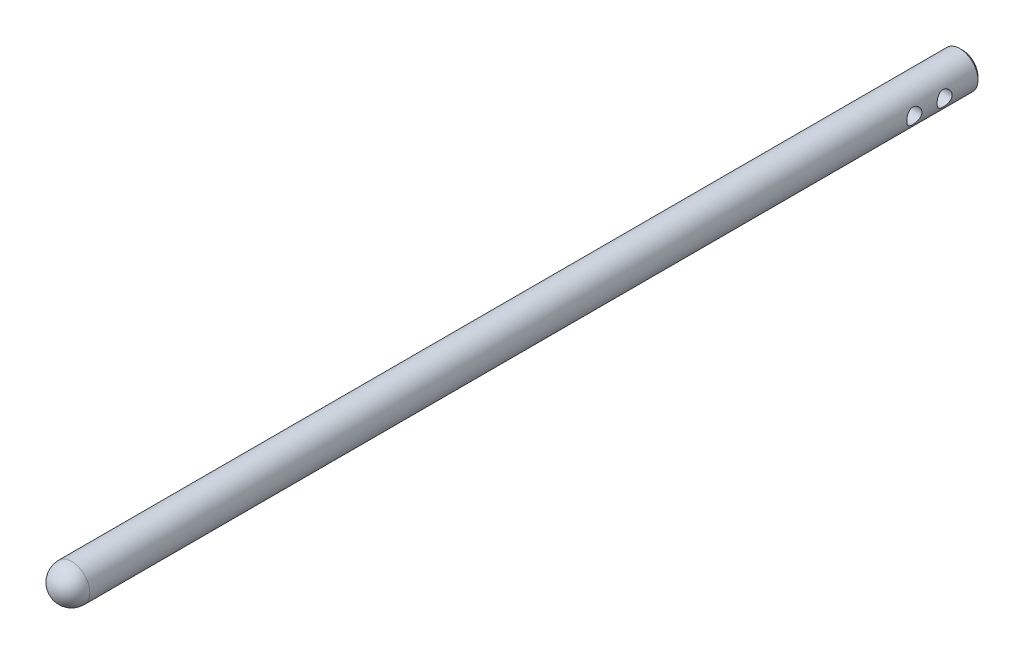
ISO-10303-21;
HEADER;
FILE_DESCRIPTION(('STEP AP214'),'2;1');
FILE_NAME('part.step','',(''),(''),'','','');
FILE_SCHEMA(('AUTOMOTIVE_DESIGN { 1 0 10303 214 1 1 1 1 }'));
ENDSEC;
DATA;
#1=APPLICATION_CONTEXT('core data for automotive mechanical design processes');
#2=APPLICATION_PROTOCOL_DEFINITION('international standard','automotive_design',2000,#1);
#3=PRODUCT_CONTEXT('',#1,'mechanical');
#4=PRODUCT('Part','Part','',(#3));
#5=PRODUCT_RELATED_PRODUCT_CATEGORY('part','',(#4));
#6=PRODUCT_DEFINITION_FORMATION('','',#4);
#7=PRODUCT_DEFINITION_CONTEXT('part definition',#1,'design');
#8=PRODUCT_DEFINITION('design','',#6,#7);
#9=PRODUCT_DEFINITION_SHAPE('','',#8);
#10=(LENGTH_UNIT() NAMED_UNIT(*) SI_UNIT(.MILLI.,.METRE.));
#11=(NAMED_UNIT(*) PLANE_ANGLE_UNIT() SI_UNIT($,.RADIAN.));
#12=(NAMED_UNIT(*) SI_UNIT($,.STERADIAN.) SOLID_ANGLE_UNIT());
#13=UNCERTAINTY_MEASURE_WITH_UNIT(LENGTH_MEASURE(1.E-05),#10,'distance_accuracy_value','');
#14=(GEOMETRIC_REPRESENTATION_CONTEXT(3) GLOBAL_UNCERTAINTY_ASSIGNED_CONTEXT((#13)) GLOBAL_UNIT_ASSIGNED_CONTEXT((#10,
#11,#12)) REPRESENTATION_CONTEXT('',''));
#15=CARTESIAN_POINT('',(0.,0.,0.));
#16=DIRECTION('',(0.,0.,1.));
#17=DIRECTION('',(1.,0.,0.));
#18=AXIS2_PLACEMENT_3D('',#15,#16,#17);
#19=CARTESIAN_POINT('',(0.,0.,300.));
#20=DIRECTION('',(0.,0.,-1.));
#21=DIRECTION('',(-1.,0.,0.));
#22=AXIS2_PLACEMENT_3D('',#19,#20,#21);
#23=CYLINDRICAL_SURFACE('',#22,6.);
#24=CARTESIAN_POINT('',(0.,0.,1.));
#25=DIRECTION('',(0.,0.,1.));
#26=DIRECTION('',(1.,0.,0.));
#27=AXIS2_PLACEMENT_3D('',#24,#25,#26);
#28=CIRCLE('',#27,6.);
#29=CARTESIAN_POINT('',(6.,0.,1.));
#30=VERTEX_POINT('',#29);
#31=EDGE_CURVE('E48',#30,#30,#28,.T.);
#32=ORIENTED_EDGE('',*,*,#31,.T.);
#33=EDGE_LOOP('',(#32));
#34=FACE_BOUND('',#33,.T.);
#35=CARTESIAN_POINT('',(-6.,0.,14.5));
#36=CARTESIAN_POINT('',(-5.99999628290907,-0.133903918163794,14.4999952878603));
#37=CARTESIAN_POINT('',(-5.99546656821164,-0.268039524991432,14.4891786843994));
#38=CARTESIAN_POINT('',(-5.97780115788617,-0.53249801999112,14.4463192619064));
#39=CARTESIAN_POINT('',(-5.96464300599791,-0.662810029808672,14.4142210532185));
#40=CARTESIAN_POINT('',(-5.93112629106012,-0.915376593299222,14.3301785119407));
#41=CARTESIAN_POINT('',(-5.91079213642029,-1.03765681434383,14.2783014076769));
#42=CARTESIAN_POINT('',(-5.8649055925345,-1.27165974779733,14.1564541669781));
#43=CARTESIAN_POINT('',(-5.83935478441347,-1.38338564416287,14.0864895110252));
#44=CARTESIAN_POINT('',(-5.78415660619864,-1.59889674004597,13.9267420881925));
#45=CARTESIAN_POINT('',(-5.75437507703432,-1.70208251703042,13.8361973967483));
#46=CARTESIAN_POINT('',(-5.69465427085228,-1.8923196601971,13.6394713160995));
#47=CARTESIAN_POINT('',(-5.66471491925558,-1.9793625312399,13.5332817462849));
#48=CARTESIAN_POINT('',(-5.60642043928224,-2.13907474876483,13.3019464489895));
#49=CARTESIAN_POINT('',(-5.57821573827599,-2.2108261616941,13.1761251042486));
#50=CARTESIAN_POINT('',(-5.52871144633222,-2.331878813161,12.9128534830571));
#51=CARTESIAN_POINT('',(-5.50740829980501,-2.38119161708799,12.7754092407429));
#52=CARTESIAN_POINT('',(-5.47557110795537,-2.45349196589845,12.4996926167385));
#53=CARTESIAN_POINT('',(-5.46456775308951,-2.47763315746001,12.361779033289));
#54=CARTESIAN_POINT('',(-5.45322652433633,-2.50250419944798,12.0834534145536));
#55=CARTESIAN_POINT('',(-5.45288276849132,-2.5032469611117,11.9430427999296));
#56=CARTESIAN_POINT('',(-5.46250239122985,-2.48216900725155,11.6751998791476));
#57=CARTESIAN_POINT('',(-5.47167765447589,-2.46207362224014,11.5475978068758));
#58=CARTESIAN_POINT('',(-5.49796965547249,-2.40278382032142,11.2977758179945));
#59=CARTESIAN_POINT('',(-5.51508791407034,-2.36358574574513,11.1755569370152));
#60=CARTESIAN_POINT('',(-5.55572369545608,-2.2664391745498,10.9368845940184));
#61=CARTESIAN_POINT('',(-5.57936963898298,-2.20810943078429,10.8206091581736));
#62=CARTESIAN_POINT('',(-5.63036662282146,-2.07462485161169,10.5990445322394));
#63=CARTESIAN_POINT('',(-5.65771912259552,-1.99946338103922,10.4937596987729));
#64=CARTESIAN_POINT('',(-5.71585953755966,-1.82699193108754,10.2878000825344));
#65=CARTESIAN_POINT('',(-5.74674242808947,-1.72834696641502,10.1882668652292));
#66=CARTESIAN_POINT('',(-5.80651346225056,-1.51545918210307,10.0067729940816));
#67=CARTESIAN_POINT('',(-5.83540113754019,-1.40121271889693,9.92481645661564));
#68=CARTESIAN_POINT('',(-5.88876567112946,-1.15689589738675,9.77912835276748));
#69=CARTESIAN_POINT('',(-5.91312533086667,-1.02652116489536,9.71586110969864));
#70=CARTESIAN_POINT('',(-5.95378962829606,-0.755704805053674,9.61255772079348));
#71=CARTESIAN_POINT('',(-5.970098716916,-0.615268789590078,9.57250873611237));
#72=CARTESIAN_POINT('',(-5.9919928237277,-0.337856226692463,9.51916801574673));
#73=CARTESIAN_POINT('',(-5.9981908209425,-0.201222570557285,9.5043442851125));
#74=CARTESIAN_POINT('',(-6.00112100737489,0.0727093109921711,9.49730755277181));
#75=CARTESIAN_POINT('',(-5.99785591423878,0.210007334305264,9.505088059496));
#76=CARTESIAN_POINT('',(-5.9826243531388,0.474196484682864,9.54194216961213));
#77=CARTESIAN_POINT('',(-5.97109774567979,0.60126593327877,9.56993990819439));
#78=CARTESIAN_POINT('',(-5.94097213544829,0.848765497942173,9.64493638908157));
#79=CARTESIAN_POINT('',(-5.92237223919408,0.969194773036707,9.69193753190061));
#80=CARTESIAN_POINT('',(-5.87916541290331,1.20421799973828,9.80514195142422));
#81=CARTESIAN_POINT('',(-5.85438982938561,1.31851447371068,9.87189636629204));
#82=CARTESIAN_POINT('',(-5.80147609158183,1.53469243246282,10.0221067555834));
#83=CARTESIAN_POINT('',(-5.77333653537473,1.63656870520374,10.1055697030586));
#84=CARTESIAN_POINT('',(-5.71424175790868,1.83266686054867,10.2938064665447));
#85=CARTESIAN_POINT('',(-5.68322903182028,1.92582139596022,10.3996770059721));
#86=CARTESIAN_POINT('',(-5.6236867353604,2.09333969221046,10.6260425518712));
#87=CARTESIAN_POINT('',(-5.59515772986988,2.16769918571026,10.746540870345));
#88=CARTESIAN_POINT('',(-5.54362772487864,2.29631920417609,11.0012283506036));
#89=CARTESIAN_POINT('',(-5.52071125109802,2.35027836475451,11.1355880710237));
#90=CARTESIAN_POINT('',(-5.48416711318335,2.43434827902353,11.4127411876261));
#91=CARTESIAN_POINT('',(-5.47053179113073,2.46447869724417,11.5555275249888));
#92=CARTESIAN_POINT('',(-5.4552632907308,2.49808160700531,11.8336373983781));
#93=CARTESIAN_POINT('',(-5.45278701929114,2.50342760836084,11.9686893245119));
#94=CARTESIAN_POINT('',(-5.45787706027259,2.49231151038001,12.2376857223555));
#95=CARTESIAN_POINT('',(-5.46544183100007,2.47585275892879,12.3716303609001));
#96=CARTESIAN_POINT('',(-5.48899102586044,2.42316809595844,12.6281854946778));
#97=CARTESIAN_POINT('',(-5.50456709625453,2.38789807270203,12.7510333459775));
#98=CARTESIAN_POINT('',(-5.54206362465904,2.29952656276963,12.989096043664));
#99=CARTESIAN_POINT('',(-5.56398586515029,2.24642006560089,13.104308734336));
#100=CARTESIAN_POINT('',(-5.61333908853254,2.1202057237392,13.331391788147));
#101=CARTESIAN_POINT('',(-5.64102204404079,2.04608723750136,13.4426446459478));
#102=CARTESIAN_POINT('',(-5.69807379131314,1.88136812596239,13.6517202931151));
#103=CARTESIAN_POINT('',(-5.72744316520044,1.79076178563716,13.7495384050324));
#104=CARTESIAN_POINT('',(-5.78712781593092,1.58780416898838,13.9362973056175));
#105=CARTESIAN_POINT('',(-5.81735619175009,1.47434977868814,14.0240726428278));
#106=CARTESIAN_POINT('',(-5.87320303099821,1.23319985958044,14.1793991300421));
#107=CARTESIAN_POINT('',(-5.89881939160172,1.1054978774169,14.2469410639968));
#108=CARTESIAN_POINT('',(-5.94218308378896,0.841465213422196,14.3584188704516));
#109=CARTESIAN_POINT('',(-5.96005349044659,0.705312056415866,14.4027264942901));
#110=CARTESIAN_POINT('',(-5.9864223497589,0.426816782070267,14.4674156875296));
#111=CARTESIAN_POINT('',(-5.99495014042422,0.284495506121992,14.4878721682058));
#112=CARTESIAN_POINT('',(-5.99888566614292,0.118052512349443,14.4973238417862));
#113=CARTESIAN_POINT('',(-5.99930292614998,0.0944569348794082,14.498326602503));
#114=CARTESIAN_POINT('',(-5.99986042138656,0.04724330906934,14.4996650982568));
#115=CARTESIAN_POINT('',(-6.0000006558228,0.0236252606651524,14.5000008313836));
#116=CARTESIAN_POINT('',(-6.,0.,14.5));
#117=B_SPLINE_CURVE_WITH_KNOTS('',3,(#35,#36,#37,#38,#39,#40,#41,#42,#43,#44,#45,#46,#47,#48,
#49,#50,#51,#52,#53,#54,#55,#56,#57,#58,#59,#60,#61,#62,#63,#64,#65,#66,#67,#68,#69,#70,#71,#72,
#73,#74,#75,#76,#77,#78,#79,#80,#81,#82,#83,#84,#85,#86,#87,#88,#89,#90,#91,#92,#93,#94,#95,#96,
#97,#98,#99,#100,#101,#102,#103,#104,#105,#106,#107,#108,#109,#110,#111,#112,#113,#114,#115,
#116),.UNSPECIFIED.,.T.,.F.,(4,2,2,2,2,2,2,2,2,2,2,2,2,2,2,2,2,2,2,2,2,2,2,2,2,2,2,2,2,2,2,2,2,
2,2,2,2,2,2,2,4),(0.,0.401613837767884,0.804277081257389,1.20558370381259,1.60676887370594,
2.02635872577614,2.4461687626293,2.8866344907825,3.32687293461176,3.74590546275115,
4.16470676498092,4.55140314405112,4.93817359454425,5.33317426117429,5.72833091434413,
6.15688282255793,6.58553498629176,7.02408110121627,7.46238448436594,7.87296886786502,
8.28343534986344,8.67353179471443,9.0636775320357,9.46594270544322,9.86837610938992,
10.2995697605859,10.7308612248068,11.1682957671905,11.6053689414916,12.0087975511929,
12.4121642259507,12.7967529992953,13.1814498990123,13.5892778679488,13.9972474685189,
14.4349307000978,14.8728129885717,15.3034571163877,15.7327450093864,15.8036033125922,
15.8744618187069),.UNSPECIFIED.);
#118=CARTESIAN_POINT('',(-6.,0.,14.5));
#119=VERTEX_POINT('',#118);
#120=EDGE_CURVE('E53',#119,#119,#117,.T.);
#121=ORIENTED_EDGE('',*,*,#120,.T.);
#122=EDGE_LOOP('',(#121));
#123=FACE_BOUND('',#122,.T.);
#124=CARTESIAN_POINT('',(6.,0.,9.5));
#125=CARTESIAN_POINT('',(5.99999628290907,-0.133903918163792,9.5000047121396));
#126=CARTESIAN_POINT('',(5.99546656821164,-0.268039524991426,9.51082131560053));
#127=CARTESIAN_POINT('',(5.97780115788617,-0.532498019991115,9.55368073809363));
#128=CARTESIAN_POINT('',(5.96464300599791,-0.662810029808671,9.58577894678152));
#129=CARTESIAN_POINT('',(5.93112629106012,-0.915376593299227,9.6698214880593));
#130=CARTESIAN_POINT('',(5.91079213642029,-1.03765681434384,9.72169859232309));
#131=CARTESIAN_POINT('',(5.8649055925345,-1.27165974779733,9.84354583302186));
#132=CARTESIAN_POINT('',(5.83935478441347,-1.38338564416288,9.91351048897477));
#133=CARTESIAN_POINT('',(5.78415660619864,-1.59889674004597,10.0732579118075));
#134=CARTESIAN_POINT('',(5.75437507703433,-1.70208251703042,10.1638026032517));
#135=CARTESIAN_POINT('',(5.69465427085228,-1.8923196601971,10.3605286839005));
#136=CARTESIAN_POINT('',(5.66471491925558,-1.9793625312399,10.4667182537151));
#137=CARTESIAN_POINT('',(5.60642043928224,-2.13907474876484,10.6980535510105));
#138=CARTESIAN_POINT('',(5.57821573827599,-2.21082616169411,10.8238748957514));
#139=CARTESIAN_POINT('',(5.52871144633222,-2.331878813161,11.0871465169429));
#140=CARTESIAN_POINT('',(5.50740829980501,-2.38119161708799,11.2245907592571));
#141=CARTESIAN_POINT('',(5.47557110795537,-2.45349196589845,11.5003073832615));
#142=CARTESIAN_POINT('',(5.46456775308951,-2.47763315746001,11.638220966711));
#143=CARTESIAN_POINT('',(5.45322652433633,-2.50250419944798,11.9165465854464));
#144=CARTESIAN_POINT('',(5.45288276849133,-2.5032469611117,12.0569572000704));
#145=CARTESIAN_POINT('',(5.46250239122985,-2.48216900725155,12.3248001208524));
#146=CARTESIAN_POINT('',(5.47167765447589,-2.46207362224014,12.4524021931242));
#147=CARTESIAN_POINT('',(5.49796965547249,-2.40278382032142,12.7022241820055));
#148=CARTESIAN_POINT('',(5.51508791407034,-2.36358574574513,12.8244430629848));
#149=CARTESIAN_POINT('',(5.55572369545608,-2.2664391745498,13.0631154059816));
#150=CARTESIAN_POINT('',(5.57936963898298,-2.20810943078429,13.1793908418264));
#151=CARTESIAN_POINT('',(5.63036662282146,-2.07462485161169,13.4009554677606));
#152=CARTESIAN_POINT('',(5.65771912259552,-1.99946338103921,13.5062403012271));
#153=CARTESIAN_POINT('',(5.71585953755966,-1.82699193108754,13.7121999174656));
#154=CARTESIAN_POINT('',(5.74674242808947,-1.72834696641502,13.8117331347708));
#155=CARTESIAN_POINT('',(5.80651346225056,-1.51545918210306,13.9932270059184));
#156=CARTESIAN_POINT('',(5.83540113754019,-1.40121271889693,14.0751835433844));
#157=CARTESIAN_POINT('',(5.88876567112946,-1.15689589738675,14.2208716472325));
#158=CARTESIAN_POINT('',(5.91312533086667,-1.02652116489536,14.2841388903014));
#159=CARTESIAN_POINT('',(5.95378962829607,-0.755704805053669,14.3874422792065));
#160=CARTESIAN_POINT('',(5.970098716916,-0.615268789590073,14.4274912638876));
#161=CARTESIAN_POINT('',(5.9919928237277,-0.337856226692458,14.4808319842533));
#162=CARTESIAN_POINT('',(5.9981908209425,-0.20122257055728,14.4956557148875));
#163=CARTESIAN_POINT('',(6.00112100737489,0.0727093109921756,14.5026924472282));
#164=CARTESIAN_POINT('',(5.99785591423878,0.210007334305268,14.494911940504));
#165=CARTESIAN_POINT('',(5.9826243531388,0.474196484682869,14.4580578303879));
#166=CARTESIAN_POINT('',(5.97109774567979,0.601265933278774,14.4300600918056));
#167=CARTESIAN_POINT('',(5.94097213544829,0.848765497942177,14.3550636109184));
#168=CARTESIAN_POINT('',(5.92237223919408,0.969194773036711,14.3080624680994));
#169=CARTESIAN_POINT('',(5.87916541290331,1.20421799973828,14.1948580485758));
#170=CARTESIAN_POINT('',(5.85438982938561,1.31851447371068,14.128103633708));
#171=CARTESIAN_POINT('',(5.80147609158182,1.53469243246282,13.9778932444166));
#172=CARTESIAN_POINT('',(5.77333653537473,1.63656870520375,13.8944302969414));
#173=CARTESIAN_POINT('',(5.71424175790867,1.83266686054867,13.7061935334553));
#174=CARTESIAN_POINT('',(5.68322903182029,1.92582139596023,13.6003229940279));
#175=CARTESIAN_POINT('',(5.6236867353604,2.09333969221046,13.3739574481288));
#176=CARTESIAN_POINT('',(5.59515772986987,2.16769918571027,13.253459129655));
#177=CARTESIAN_POINT('',(5.54362772487864,2.2963192041761,12.9987716493964));
#178=CARTESIAN_POINT('',(5.52071125109802,2.35027836475451,12.8644119289763));
#179=CARTESIAN_POINT('',(5.48416711318335,2.43434827902353,12.5872588123739));
#180=CARTESIAN_POINT('',(5.47053179113073,2.46447869724417,12.4444724750112));
#181=CARTESIAN_POINT('',(5.4552632907308,2.49808160700531,12.1663626016219));
#182=CARTESIAN_POINT('',(5.45278701929114,2.50342760836084,12.0313106754881));
#183=CARTESIAN_POINT('',(5.45787706027259,2.49231151038,11.7623142776445));
#184=CARTESIAN_POINT('',(5.46544183100007,2.47585275892879,11.6283696390999));
#185=CARTESIAN_POINT('',(5.48899102586044,2.42316809595844,11.3718145053222));
#186=CARTESIAN_POINT('',(5.50456709625453,2.38789807270203,11.2489666540225));
#187=CARTESIAN_POINT('',(5.54206362465904,2.29952656276963,11.010903956336));
#188=CARTESIAN_POINT('',(5.56398586515029,2.24642006560089,10.895691265664));
#189=CARTESIAN_POINT('',(5.61333908853254,2.1202057237392,10.668608211853));
#190=CARTESIAN_POINT('',(5.64102204404079,2.04608723750136,10.5573553540522));
#191=CARTESIAN_POINT('',(5.69807379131314,1.88136812596239,10.3482797068849));
#192=CARTESIAN_POINT('',(5.72744316520044,1.79076178563715,10.2504615949676));
#193=CARTESIAN_POINT('',(5.78712781593092,1.58780416898838,10.0637026943825));
#194=CARTESIAN_POINT('',(5.8173561917501,1.47434977868813,9.9759273571722));
#195=CARTESIAN_POINT('',(5.87320303099822,1.23319985958043,9.82060086995789));
#196=CARTESIAN_POINT('',(5.89881939160172,1.1054978774169,9.75305893600317));
#197=CARTESIAN_POINT('',(5.94218308378896,0.841465213422194,9.6415811295484));
#198=CARTESIAN_POINT('',(5.96005349044659,0.705312056415867,9.59727350570992));
#199=CARTESIAN_POINT('',(5.9864223497589,0.426816782070267,9.53258431247041));
#200=CARTESIAN_POINT('',(5.99495014042422,0.284495506121988,9.51212783179419));
#201=CARTESIAN_POINT('',(5.99888566614292,0.118052512349436,9.50267615821379));
#202=CARTESIAN_POINT('',(5.99930292614998,0.0944569348794014,9.50167339749698));
#203=CARTESIAN_POINT('',(5.99986042138656,0.047243309069335,9.50033490174322));
#204=CARTESIAN_POINT('',(6.0000006558228,0.0236252606651492,9.49999916861636));
#205=CARTESIAN_POINT('',(6.,0.,9.5));
#206=B_SPLINE_CURVE_WITH_KNOTS('',3,(#124,#125,#126,#127,#128,#129,#130,#131,#132,#133,#134,
#135,#136,#137,#138,#139,#140,#141,#142,#143,#144,#145,#146,#147,#148,#149,#150,#151,#152,#153,
#154,#155,#156,#157,#158,#159,#160,#161,#162,#163,#164,#165,#166,#167,#168,#169,#170,#171,#172,
#173,#174,#175,#176,#177,#178,#179,#180,#181,#182,#183,#184,#185,#186,#187,#188,#189,#190,#191,
#192,#193,#194,#195,#196,#197,#198,#199,#200,#201,#202,#203,#204,#205),.UNSPECIFIED.,.T.,.F.,(4,
2,2,2,2,2,2,2,2,2,2,2,2,2,2,2,2,2,2,2,2,2,2,2,2,2,2,2,2,2,2,2,2,2,2,2,2,2,2,2,4),(0.,
0.401613837767878,0.804277081257394,1.2055837038126,1.60676887370595,2.02635872577614,
2.44616876262931,2.88663449078251,3.32687293461176,3.74590546275115,4.16470676498092,
4.55140314405113,4.93817359454425,5.33317426117429,5.72833091434413,6.15688282255793,
6.58553498629176,7.02408110121627,7.46238448436595,7.87296886786503,8.28343534986344,
8.67353179471444,9.06367753203571,9.46594270544323,9.86837610938992,10.2995697605859,
10.7308612248068,11.1682957671905,11.6053689414916,12.0087975511929,12.4121642259507,
12.7967529992953,13.1814498990123,13.5892778679488,13.9972474685189,14.4349307000978,
14.8728129885717,15.3034571163877,15.7327450093864,15.8036033125922,15.8744618187069),.UNSPECIFIED.);
#207=CARTESIAN_POINT('',(6.,0.,9.5));
#208=VERTEX_POINT('',#207);
#209=EDGE_CURVE('E58',#208,#208,#206,.T.);
#210=ORIENTED_EDGE('',*,*,#209,.T.);
#211=EDGE_LOOP('',(#210));
#212=FACE_BOUND('',#211,.T.);
#213=CARTESIAN_POINT('',(-6.,0.,24.5));
#214=CARTESIAN_POINT('',(-5.99999628290907,-0.133903918163793,24.4999952878603));
#215=CARTESIAN_POINT('',(-5.99546656821164,-0.26803952499143,24.4891786843994));
#216=CARTESIAN_POINT('',(-5.97780115788617,-0.532498019991119,24.4463192619064));
#217=CARTESIAN_POINT('',(-5.96464300599791,-0.662810029808671,24.4142210532185));
#218=CARTESIAN_POINT('',(-5.93112629106012,-0.915376593299222,24.3301785119407));
#219=CARTESIAN_POINT('',(-5.91079213642029,-1.03765681434384,24.2783014076769));
#220=CARTESIAN_POINT('',(-5.8649055925345,-1.27165974779733,24.1564541669781));
#221=CARTESIAN_POINT('',(-5.83935478441347,-1.38338564416287,24.0864895110252));
#222=CARTESIAN_POINT('',(-5.78415660619864,-1.59889674004597,23.9267420881925));
#223=CARTESIAN_POINT('',(-5.75437507703433,-1.70208251703041,23.8361973967483));
#224=CARTESIAN_POINT('',(-5.69465427085229,-1.8923196601971,23.6394713160995));
#225=CARTESIAN_POINT('',(-5.66471491925558,-1.9793625312399,23.5332817462849));
#226=CARTESIAN_POINT('',(-5.60642043928224,-2.13907474876483,23.3019464489895));
#227=CARTESIAN_POINT('',(-5.57821573827599,-2.2108261616941,23.1761251042486));
#228=CARTESIAN_POINT('',(-5.52871144633222,-2.331878813161,22.9128534830571));
#229=CARTESIAN_POINT('',(-5.50740829980501,-2.38119161708799,22.7754092407429));
#230=CARTESIAN_POINT('',(-5.47557110795537,-2.45349196589845,22.4996926167385));
#231=CARTESIAN_POINT('',(-5.46456775308951,-2.47763315746001,22.361779033289));
#232=CARTESIAN_POINT('',(-5.45322652433633,-2.50250419944798,22.0834534145536));
#233=CARTESIAN_POINT('',(-5.45288276849132,-2.5032469611117,21.9430427999296));
#234=CARTESIAN_POINT('',(-5.46250239122985,-2.48216900725155,21.6751998791476));
#235=CARTESIAN_POINT('',(-5.47167765447589,-2.46207362224014,21.5475978068758));
#236=CARTESIAN_POINT('',(-5.49796965547249,-2.40278382032142,21.2977758179945));
#237=CARTESIAN_POINT('',(-5.51508791407034,-2.36358574574513,21.1755569370152));
#238=CARTESIAN_POINT('',(-5.55572369545608,-2.2664391745498,20.9368845940184));
#239=CARTESIAN_POINT('',(-5.57936963898298,-2.20810943078429,20.8206091581736));
#240=CARTESIAN_POINT('',(-5.63036662282146,-2.07462485161169,20.5990445322394));
#241=CARTESIAN_POINT('',(-5.65771912259552,-1.99946338103922,20.4937596987729));
#242=CARTESIAN_POINT('',(-5.71585953755966,-1.82699193108755,20.2878000825344));
#243=CARTESIAN_POINT('',(-5.74674242808947,-1.72834696641502,20.1882668652292));
#244=CARTESIAN_POINT('',(-5.80651346225056,-1.51545918210307,20.0067729940816));
#245=CARTESIAN_POINT('',(-5.83540113754019,-1.40121271889693,19.9248164566156));
#246=CARTESIAN_POINT('',(-5.88876567112946,-1.15689589738675,19.7791283527675));
#247=CARTESIAN_POINT('',(-5.91312533086667,-1.02652116489537,19.7158611096986));
#248=CARTESIAN_POINT('',(-5.95378962829606,-0.755704805053675,19.6125577207935));
#249=CARTESIAN_POINT('',(-5.970098716916,-0.615268789590079,19.5725087361124));
#250=CARTESIAN_POINT('',(-5.9919928237277,-0.337856226692465,19.5191680157467));
#251=CARTESIAN_POINT('',(-5.9981908209425,-0.201222570557287,19.5043442851125));
#252=CARTESIAN_POINT('',(-6.00112100737489,0.0727093109921689,19.4973075527718));
#253=CARTESIAN_POINT('',(-5.99785591423878,0.210007334305262,19.505088059496));
#254=CARTESIAN_POINT('',(-5.9826243531388,0.474196484682862,19.5419421696121));
#255=CARTESIAN_POINT('',(-5.97109774567979,0.601265933278767,19.5699399081944));
#256=CARTESIAN_POINT('',(-5.94097213544829,0.84876549794217,19.6449363890816));
#257=CARTESIAN_POINT('',(-5.92237223919408,0.969194773036704,19.6919375319006));
#258=CARTESIAN_POINT('',(-5.87916541290331,1.20421799973828,19.8051419514242));
#259=CARTESIAN_POINT('',(-5.85438982938561,1.31851447371068,19.871896366292));
#260=CARTESIAN_POINT('',(-5.80147609158183,1.53469243246282,20.0221067555834));
#261=CARTESIAN_POINT('',(-5.77333653537473,1.63656870520374,20.1055697030586));
#262=CARTESIAN_POINT('',(-5.71424175790868,1.83266686054867,20.2938064665447));
#263=CARTESIAN_POINT('',(-5.68322903182029,1.92582139596022,20.3996770059721));
#264=CARTESIAN_POINT('',(-5.6236867353604,2.09333969221046,20.6260425518712));
#265=CARTESIAN_POINT('',(-5.59515772986988,2.16769918571026,20.746540870345));
#266=CARTESIAN_POINT('',(-5.54362772487864,2.29631920417609,21.0012283506036));
#267=CARTESIAN_POINT('',(-5.52071125109802,2.35027836475451,21.1355880710237));
#268=CARTESIAN_POINT('',(-5.48416711318335,2.43434827902353,21.4127411876261));
#269=CARTESIAN_POINT('',(-5.47053179113073,2.46447869724417,21.5555275249888));
#270=CARTESIAN_POINT('',(-5.4552632907308,2.49808160700531,21.833637398378));
#271=CARTESIAN_POINT('',(-5.45278701929114,2.50342760836084,21.9686893245119));
#272=CARTESIAN_POINT('',(-5.45787706027259,2.49231151038,22.2376857223555));
#273=CARTESIAN_POINT('',(-5.46544183100007,2.47585275892879,22.3716303609001));
#274=CARTESIAN_POINT('',(-5.48899102586044,2.42316809595844,22.6281854946778));
#275=CARTESIAN_POINT('',(-5.50456709625453,2.38789807270203,22.7510333459775));
#276=CARTESIAN_POINT('',(-5.54206362465904,2.29952656276963,22.989096043664));
#277=CARTESIAN_POINT('',(-5.56398586515029,2.24642006560089,23.104308734336));
#278=CARTESIAN_POINT('',(-5.61333908853254,2.1202057237392,23.331391788147));
#279=CARTESIAN_POINT('',(-5.64102204404079,2.04608723750136,23.4426446459478));
#280=CARTESIAN_POINT('',(-5.69807379131314,1.88136812596239,23.6517202931151));
#281=CARTESIAN_POINT('',(-5.72744316520044,1.79076178563715,23.7495384050324));
#282=CARTESIAN_POINT('',(-5.78712781593092,1.58780416898838,23.9362973056175));
#283=CARTESIAN_POINT('',(-5.81735619175009,1.47434977868814,24.0240726428278));
#284=CARTESIAN_POINT('',(-5.87320303099821,1.23319985958043,24.1793991300421));
#285=CARTESIAN_POINT('',(-5.89881939160172,1.1054978774169,24.2469410639968));
#286=CARTESIAN_POINT('',(-5.94218308378896,0.841465213422195,24.3584188704516));
#287=CARTESIAN_POINT('',(-5.96005349044659,0.705312056415867,24.4027264942901));
#288=CARTESIAN_POINT('',(-5.9864223497589,0.426816782070268,24.4674156875296));
#289=CARTESIAN_POINT('',(-5.99495014042422,0.284495506121992,24.4878721682058));
#290=CARTESIAN_POINT('',(-5.99888566614292,0.118052512349442,24.4973238417862));
#291=CARTESIAN_POINT('',(-5.99930292614998,0.0944569348794058,24.498326602503));
#292=CARTESIAN_POINT('',(-5.99986042138656,0.0472433090693375,24.4996650982568));
#293=CARTESIAN_POINT('',(-6.0000006558228,0.0236252606651512,24.5000008313836));
#294=CARTESIAN_POINT('',(-6.,0.,24.5));
#295=B_SPLINE_CURVE_WITH_KNOTS('',3,(#213,#214,#215,#216,#217,#218,#219,#220,#221,#222,#223,
#224,#225,#226,#227,#228,#229,#230,#231,#232,#233,#234,#235,#236,#237,#238,#239,#240,#241,#242,
#243,#244,#245,#246,#247,#248,#249,#250,#251,#252,#253,#254,#255,#256,#257,#258,#259,#260,#261,
#262,#263,#264,#265,#266,#267,#268,#269,#270,#271,#272,#273,#274,#275,#276,#277,#278,#279,#280,
#281,#282,#283,#284,#285,#286,#287,#288,#289,#290,#291,#292,#293,#294),.UNSPECIFIED.,.T.,.F.,(4,
2,2,2,2,2,2,2,2,2,2,2,2,2,2,2,2,2,2,2,2,2,2,2,2,2,2,2,2,2,2,2,2,2,2,2,2,2,2,2,4),(0.,
0.401613837767882,0.804277081257389,1.20558370381259,1.60676887370594,2.02635872577614,
2.4461687626293,2.8866344907825,3.32687293461176,3.74590546275115,4.16470676498092,
4.55140314405113,4.93817359454425,5.33317426117429,5.72833091434412,6.15688282255793,
6.58553498629176,7.02408110121626,7.46238448436594,7.87296886786502,8.28343534986343,
8.67353179471442,9.0636775320357,9.46594270544322,9.86837610938991,10.2995697605859,
10.7308612248068,11.1682957671905,11.6053689414916,12.0087975511929,12.4121642259507,
12.7967529992952,13.1814498990123,13.5892778679488,13.9972474685189,14.4349307000978,
14.8728129885716,15.3034571163877,15.7327450093864,15.8036033125922,15.8744618187069),.UNSPECIFIED.);
#296=CARTESIAN_POINT('',(-6.,0.,24.5));
#297=VERTEX_POINT('',#296);
#298=EDGE_CURVE('E91',#297,#297,#295,.T.);
#299=ORIENTED_EDGE('',*,*,#298,.T.);
#300=EDGE_LOOP('',(#299));
#301=FACE_BOUND('',#300,.T.);
#302=CARTESIAN_POINT('',(6.,0.,19.5));
#303=CARTESIAN_POINT('',(5.99999628290907,-0.133903918163793,19.5000047121396));
#304=CARTESIAN_POINT('',(5.99546656821164,-0.268039524991427,19.5108213156005));
#305=CARTESIAN_POINT('',(5.97780115788617,-0.532498019991116,19.5536807380936));
#306=CARTESIAN_POINT('',(5.96464300599791,-0.662810029808672,19.5857789467815));
#307=CARTESIAN_POINT('',(5.93112629106012,-0.915376593299228,19.6698214880593));
#308=CARTESIAN_POINT('',(5.91079213642029,-1.03765681434384,19.7216985923231));
#309=CARTESIAN_POINT('',(5.8649055925345,-1.27165974779733,19.8435458330219));
#310=CARTESIAN_POINT('',(5.83935478441347,-1.38338564416288,19.9135104889748));
#311=CARTESIAN_POINT('',(5.78415660619864,-1.59889674004597,20.0732579118075));
#312=CARTESIAN_POINT('',(5.75437507703433,-1.70208251703042,20.1638026032517));
#313=CARTESIAN_POINT('',(5.69465427085228,-1.8923196601971,20.3605286839005));
#314=CARTESIAN_POINT('',(5.66471491925558,-1.9793625312399,20.4667182537151));
#315=CARTESIAN_POINT('',(5.60642043928224,-2.13907474876484,20.6980535510105));
#316=CARTESIAN_POINT('',(5.57821573827599,-2.21082616169411,20.8238748957514));
#317=CARTESIAN_POINT('',(5.52871144633222,-2.331878813161,21.0871465169429));
#318=CARTESIAN_POINT('',(5.50740829980501,-2.38119161708799,21.2245907592571));
#319=CARTESIAN_POINT('',(5.47557110795537,-2.45349196589845,21.5003073832615));
#320=CARTESIAN_POINT('',(5.46456775308951,-2.47763315746001,21.638220966711));
#321=CARTESIAN_POINT('',(5.45322652433633,-2.50250419944798,21.9165465854464));
#322=CARTESIAN_POINT('',(5.45288276849133,-2.5032469611117,22.0569572000704));
#323=CARTESIAN_POINT('',(5.46250239122986,-2.48216900725155,22.3248001208524));
#324=CARTESIAN_POINT('',(5.47167765447589,-2.46207362224014,22.4524021931242));
#325=CARTESIAN_POINT('',(5.49796965547249,-2.40278382032142,22.7022241820055));
#326=CARTESIAN_POINT('',(5.51508791407034,-2.36358574574513,22.8244430629848));
#327=CARTESIAN_POINT('',(5.55572369545608,-2.2664391745498,23.0631154059816));
#328=CARTESIAN_POINT('',(5.57936963898298,-2.20810943078428,23.1793908418264));
#329=CARTESIAN_POINT('',(5.63036662282146,-2.07462485161169,23.4009554677606));
#330=CARTESIAN_POINT('',(5.65771912259552,-1.99946338103921,23.5062403012271));
#331=CARTESIAN_POINT('',(5.71585953755966,-1.82699193108754,23.7121999174656));
#332=CARTESIAN_POINT('',(5.74674242808947,-1.72834696641502,23.8117331347708));
#333=CARTESIAN_POINT('',(5.80651346225056,-1.51545918210307,23.9932270059184));
#334=CARTESIAN_POINT('',(5.83540113754019,-1.40121271889693,24.0751835433844));
#335=CARTESIAN_POINT('',(5.88876567112946,-1.15689589738675,24.2208716472325));
#336=CARTESIAN_POINT('',(5.91312533086667,-1.02652116489536,24.2841388903014));
#337=CARTESIAN_POINT('',(5.95378962829607,-0.75570480505367,24.3874422792065));
#338=CARTESIAN_POINT('',(5.970098716916,-0.615268789590074,24.4274912638876));
#339=CARTESIAN_POINT('',(5.9919928237277,-0.337856226692459,24.4808319842533));
#340=CARTESIAN_POINT('',(5.9981908209425,-0.201222570557281,24.4956557148875));
#341=CARTESIAN_POINT('',(6.00112100737489,0.0727093109921744,24.5026924472282));
#342=CARTESIAN_POINT('',(5.99785591423878,0.210007334305267,24.494911940504));
#343=CARTESIAN_POINT('',(5.9826243531388,0.474196484682867,24.4580578303879));
#344=CARTESIAN_POINT('',(5.97109774567979,0.601265933278772,24.4300600918056));
#345=CARTESIAN_POINT('',(5.94097213544829,0.848765497942175,24.3550636109184));
#346=CARTESIAN_POINT('',(5.92237223919408,0.96919477303671,24.3080624680994));
#347=CARTESIAN_POINT('',(5.87916541290331,1.20421799973828,24.1948580485758));
#348=CARTESIAN_POINT('',(5.85438982938561,1.31851447371068,24.128103633708));
#349=CARTESIAN_POINT('',(5.80147609158182,1.53469243246282,23.9778932444166));
#350=CARTESIAN_POINT('',(5.77333653537473,1.63656870520374,23.8944302969414));
#351=CARTESIAN_POINT('',(5.71424175790867,1.83266686054867,23.7061935334553));
#352=CARTESIAN_POINT('',(5.68322903182028,1.92582139596023,23.6003229940279));
#353=CARTESIAN_POINT('',(5.6236867353604,2.09333969221046,23.3739574481288));
#354=CARTESIAN_POINT('',(5.59515772986987,2.16769918571027,23.253459129655));
#355=CARTESIAN_POINT('',(5.54362772487864,2.29631920417609,22.9987716493964));
#356=CARTESIAN_POINT('',(5.52071125109802,2.35027836475451,22.8644119289763));
#357=CARTESIAN_POINT('',(5.48416711318335,2.43434827902353,22.5872588123739));
#358=CARTESIAN_POINT('',(5.47053179113073,2.46447869724417,22.4444724750112));
#359=CARTESIAN_POINT('',(5.4552632907308,2.49808160700531,22.1663626016219));
#360=CARTESIAN_POINT('',(5.45278701929114,2.50342760836084,22.0313106754881));
#361=CARTESIAN_POINT('',(5.45787706027259,2.49231151038,21.7623142776445));
#362=CARTESIAN_POINT('',(5.46544183100007,2.47585275892879,21.6283696390999));
#363=CARTESIAN_POINT('',(5.48899102586044,2.42316809595844,21.3718145053222));
#364=CARTESIAN_POINT('',(5.50456709625453,2.38789807270203,21.2489666540225));
#365=CARTESIAN_POINT('',(5.54206362465904,2.29952656276963,21.010903956336));
#366=CARTESIAN_POINT('',(5.56398586515029,2.24642006560088,20.895691265664));
#367=CARTESIAN_POINT('',(5.61333908853254,2.1202057237392,20.668608211853));
#368=CARTESIAN_POINT('',(5.64102204404079,2.04608723750136,20.5573553540522));
#369=CARTESIAN_POINT('',(5.69807379131314,1.88136812596239,20.3482797068849));
#370=CARTESIAN_POINT('',(5.72744316520044,1.79076178563715,20.2504615949676));
#371=CARTESIAN_POINT('',(5.78712781593093,1.58780416898837,20.0637026943825));
#372=CARTESIAN_POINT('',(5.8173561917501,1.47434977868813,19.9759273571722));
#373=CARTESIAN_POINT('',(5.87320303099821,1.23319985958043,19.8206008699579));
#374=CARTESIAN_POINT('',(5.89881939160172,1.1054978774169,19.7530589360032));
#375=CARTESIAN_POINT('',(5.94218308378896,0.841465213422192,19.6415811295484));
#376=CARTESIAN_POINT('',(5.96005349044659,0.705312056415866,19.5972735057099));
#377=CARTESIAN_POINT('',(5.9864223497589,0.426816782070268,19.5325843124704));
#378=CARTESIAN_POINT('',(5.99495014042422,0.284495506121989,19.5121278317942));
#379=CARTESIAN_POINT('',(5.99888566614292,0.118052512349437,19.5026761582138));
#380=CARTESIAN_POINT('',(5.99930292614998,0.0944569348794018,19.501673397497));
#381=CARTESIAN_POINT('',(5.99986042138656,0.0472433090693345,19.5003349017432));
#382=CARTESIAN_POINT('',(6.0000006558228,0.0236252606651483,19.4999991686164));
#383=CARTESIAN_POINT('',(6.,0.,19.5));
#384=B_SPLINE_CURVE_WITH_KNOTS('',3,(#302,#303,#304,#305,#306,#307,#308,#309,#310,#311,#312,
#313,#314,#315,#316,#317,#318,#319,#320,#321,#322,#323,#324,#325,#326,#327,#328,#329,#330,#331,
#332,#333,#334,#335,#336,#337,#338,#339,#340,#341,#342,#343,#344,#345,#346,#347,#348,#349,#350,
#351,#352,#353,#354,#355,#356,#357,#358,#359,#360,#361,#362,#363,#364,#365,#366,#367,#368,#369,
#370,#371,#372,#373,#374,#375,#376,#377,#378,#379,#380,#381,#382,#383),.UNSPECIFIED.,.T.,.F.,(4,
2,2,2,2,2,2,2,2,2,2,2,2,2,2,2,2,2,2,2,2,2,2,2,2,2,2,2,2,2,2,2,2,2,2,2,2,2,2,2,4),(0.,
0.401613837767878,0.804277081257394,1.2055837038126,1.60676887370595,2.02635872577614,
2.44616876262931,2.88663449078251,3.32687293461176,3.74590546275115,4.16470676498093,
4.55140314405113,4.93817359454426,5.3331742611743,5.72833091434413,6.15688282255793,
6.58553498629176,7.02408110121627,7.46238448436594,7.87296886786502,8.28343534986344,
8.67353179471443,9.0636775320357,9.46594270544322,9.86837610938992,10.2995697605859,
10.7308612248068,11.1682957671905,11.6053689414916,12.0087975511929,12.4121642259507,
12.7967529992953,13.1814498990123,13.5892778679488,13.9972474685189,14.4349307000978,
14.8728129885716,15.3034571163877,15.7327450093864,15.8036033125921,15.8744618187069),.UNSPECIFIED.);
#385=CARTESIAN_POINT('',(6.,0.,19.5));
#386=VERTEX_POINT('',#385);
#387=EDGE_CURVE('E86',#386,#386,#384,.T.);
#388=ORIENTED_EDGE('',*,*,#387,.T.);
#389=EDGE_LOOP('',(#388));
#390=FACE_BOUND('',#389,.T.);
#391=CARTESIAN_POINT('',(0.,0.,294.));
#392=DIRECTION('',(0.,0.,-1.));
#393=DIRECTION('',(-1.,0.,0.));
#394=AXIS2_PLACEMENT_3D('',#391,#392,#393);
#395=CIRCLE('',#394,6.);
#396=CARTESIAN_POINT('',(-6.,0.,294.));
#397=VERTEX_POINT('',#396);
#398=EDGE_CURVE('E103',#397,#397,#395,.T.);
#399=ORIENTED_EDGE('',*,*,#398,.T.);
#400=EDGE_LOOP('',(#399));
#401=FACE_BOUND('',#400,.T.);
#402=ADVANCED_FACE('F39',(#34,#123,#212,#301,#390,#401),#23,.T.);
#403=CARTESIAN_POINT('',(0.,0.,0.));
#404=DIRECTION('',(0.,0.,1.));
#405=DIRECTION('',(1.,0.,0.));
#406=AXIS2_PLACEMENT_3D('',#403,#404,#405);
#407=PLANE('',#406);
#408=CARTESIAN_POINT('',(0.,0.,0.));
#409=DIRECTION('',(0.,0.,1.));
#410=DIRECTION('',(1.,0.,0.));
#411=AXIS2_PLACEMENT_3D('',#408,#409,#410);
#412=CIRCLE('',#411,5.00000000000003);
#413=CARTESIAN_POINT('',(5.00000000000003,0.,0.));
#414=VERTEX_POINT('',#413);
#415=EDGE_CURVE('E10',#414,#414,#412,.F.);
#416=ORIENTED_EDGE('',*,*,#415,.T.);
#417=EDGE_LOOP('',(#416));
#418=FACE_BOUND('',#417,.T.);
#419=ADVANCED_FACE('F83',(#418),#407,.F.);
#420=CARTESIAN_POINT('',(0.,0.,294.));
#421=DIRECTION('',(0.,0.,1.));
#422=DIRECTION('',(1.,0.,0.));
#423=AXIS2_PLACEMENT_3D('',#420,#421,#422);
#424=SPHERICAL_SURFACE('',#423,6.);
#425=ORIENTED_EDGE('',*,*,#398,.F.);
#426=EDGE_LOOP('',(#425));
#427=FACE_BOUND('',#426,.T.);
#428=ADVANCED_FACE('F81',(#427),#424,.T.);
#429=CARTESIAN_POINT('',(-6.,0.,22.));
#430=DIRECTION('',(1.,0.,0.));
#431=DIRECTION('',(0.,0.,-1.));
#432=AXIS2_PLACEMENT_3D('',#429,#430,#431);
#433=CYLINDRICAL_SURFACE('',#432,2.5);
#434=ORIENTED_EDGE('',*,*,#387,.F.);
#435=EDGE_LOOP('',(#434));
#436=FACE_BOUND('',#435,.T.);
#437=ORIENTED_EDGE('',*,*,#298,.F.);
#438=EDGE_LOOP('',(#437));
#439=FACE_BOUND('',#438,.T.);
#440=ADVANCED_FACE('F76',(#436,#439),#433,.F.);
#441=CARTESIAN_POINT('',(-6.,0.,12.));
#442=DIRECTION('',(1.,0.,0.));
#443=DIRECTION('',(0.,0.,-1.));
#444=AXIS2_PLACEMENT_3D('',#441,#442,#443);
#445=CYLINDRICAL_SURFACE('',#444,2.5);
#446=ORIENTED_EDGE('',*,*,#209,.F.);
#447=EDGE_LOOP('',(#446));
#448=FACE_BOUND('',#447,.T.);
#449=ORIENTED_EDGE('',*,*,#120,.F.);
#450=EDGE_LOOP('',(#449));
#451=FACE_BOUND('',#450,.T.);
#452=ADVANCED_FACE('F72',(#448,#451),#445,.F.);
#453=CARTESIAN_POINT('',(0.,0.,1.));
#454=DIRECTION('',(0.,0.,1.));
#455=DIRECTION('',(1.,0.,0.));
#456=AXIS2_PLACEMENT_3D('',#453,#454,#455);
#457=CONICAL_SURFACE('',#456,6.,0.785398163397432);
#458=ORIENTED_EDGE('',*,*,#415,.F.);
#459=EDGE_LOOP('',(#458));
#460=FACE_BOUND('',#459,.T.);
#461=ORIENTED_EDGE('',*,*,#31,.F.);
#462=EDGE_LOOP('',(#461));
#463=FACE_BOUND('',#462,.T.);
#464=ADVANCED_FACE('F42',(#460,#463),#457,.T.);
#465=CLOSED_SHELL('',(#402,#419,#428,#440,#452,#464));
#466=MANIFOLD_SOLID_BREP('B2',#465);
#467=ADVANCED_BREP_SHAPE_REPRESENTATION('',(#18,#466),#14);
#468=SHAPE_DEFINITION_REPRESENTATION(#9,#467);
ENDSEC;
END-ISO-10303-21;
